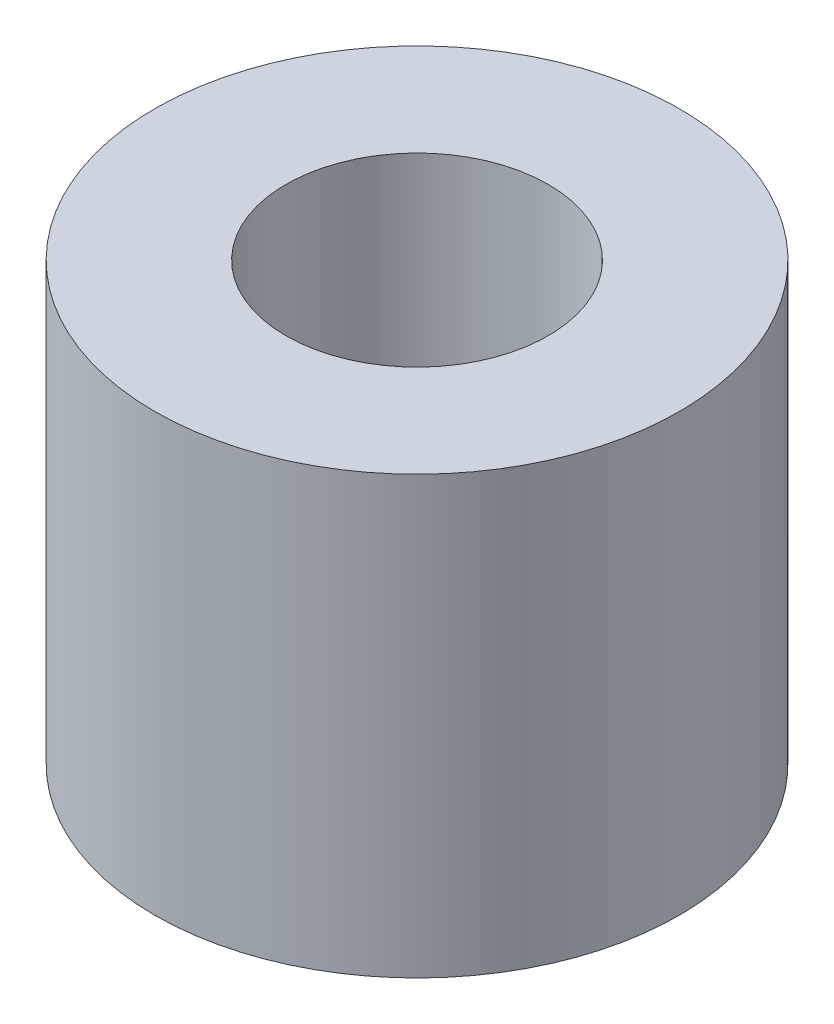
ISO-10303-21;
HEADER;
FILE_DESCRIPTION(('STEP AP214'),'2;1');
FILE_NAME('part.step','',(''),(''),'','','');
FILE_SCHEMA(('AUTOMOTIVE_DESIGN { 1 0 10303 214 1 1 1 1 }'));
ENDSEC;
DATA;
#1=APPLICATION_CONTEXT('core data for automotive mechanical design processes');
#2=APPLICATION_PROTOCOL_DEFINITION('international standard','automotive_design',2000,#1);
#3=PRODUCT_CONTEXT('',#1,'mechanical');
#4=PRODUCT('Part','Part','',(#3));
#5=PRODUCT_RELATED_PRODUCT_CATEGORY('part','',(#4));
#6=PRODUCT_DEFINITION_FORMATION('','',#4);
#7=PRODUCT_DEFINITION_CONTEXT('part definition',#1,'design');
#8=PRODUCT_DEFINITION('design','',#6,#7);
#9=PRODUCT_DEFINITION_SHAPE('','',#8);
#10=(LENGTH_UNIT() NAMED_UNIT(*) SI_UNIT(.MILLI.,.METRE.));
#11=(NAMED_UNIT(*) PLANE_ANGLE_UNIT() SI_UNIT($,.RADIAN.));
#12=(NAMED_UNIT(*) SI_UNIT($,.STERADIAN.) SOLID_ANGLE_UNIT());
#13=UNCERTAINTY_MEASURE_WITH_UNIT(LENGTH_MEASURE(1.E-05),#10,'distance_accuracy_value','');
#14=(GEOMETRIC_REPRESENTATION_CONTEXT(3) GLOBAL_UNCERTAINTY_ASSIGNED_CONTEXT((#13)) GLOBAL_UNIT_ASSIGNED_CONTEXT((#10,
#11,#12)) REPRESENTATION_CONTEXT('',''));
#15=CARTESIAN_POINT('',(0.,0.,0.));
#16=DIRECTION('',(0.,0.,1.));
#17=DIRECTION('',(1.,0.,0.));
#18=AXIS2_PLACEMENT_3D('',#15,#16,#17);
#19=CARTESIAN_POINT('',(0.,4.99,0.0185236370604577));
#20=DIRECTION('',(0.,1.,0.));
#21=DIRECTION('',(0.,0.,1.));
#22=AXIS2_PLACEMENT_3D('',#19,#20,#21);
#23=PLANE('',#22);
#24=CARTESIAN_POINT('',(0.,4.99,0.0185236370604577));
#25=DIRECTION('',(0.,1.,0.));
#26=DIRECTION('',(0.,0.,1.));
#27=AXIS2_PLACEMENT_3D('',#24,#25,#26);
#28=CIRCLE('',#27,3.);
#29=CARTESIAN_POINT('',(0.,4.99,3.01852363706046));
#30=VERTEX_POINT('',#29);
#31=EDGE_CURVE('E10',#30,#30,#28,.T.);
#32=ORIENTED_EDGE('',*,*,#31,.T.);
#33=EDGE_LOOP('',(#32));
#34=FACE_BOUND('',#33,.T.);
#35=CARTESIAN_POINT('',(0.,4.99,0.0185236370604577));
#36=DIRECTION('',(0.,1.,0.));
#37=DIRECTION('',(0.,0.,1.));
#38=AXIS2_PLACEMENT_3D('',#35,#36,#37);
#39=CIRCLE('',#38,1.5);
#40=CARTESIAN_POINT('',(0.,4.99,1.51852363706046));
#41=VERTEX_POINT('',#40);
#42=EDGE_CURVE('E54',#41,#41,#39,.T.);
#43=ORIENTED_EDGE('',*,*,#42,.F.);
#44=EDGE_LOOP('',(#43));
#45=FACE_BOUND('',#44,.T.);
#46=ADVANCED_FACE('F41',(#34,#45),#23,.T.);
#47=CARTESIAN_POINT('',(0.,0.,0.0185236370604577));
#48=DIRECTION('',(0.,1.,0.));
#49=DIRECTION('',(0.,0.,1.));
#50=AXIS2_PLACEMENT_3D('',#47,#48,#49);
#51=PLANE('',#50);
#52=CARTESIAN_POINT('',(0.,0.,0.0185236370604577));
#53=DIRECTION('',(0.,1.,0.));
#54=DIRECTION('',(0.,0.,1.));
#55=AXIS2_PLACEMENT_3D('',#52,#53,#54);
#56=CIRCLE('',#55,3.);
#57=CARTESIAN_POINT('',(0.,0.,3.01852363706046));
#58=VERTEX_POINT('',#57);
#59=EDGE_CURVE('E45',#58,#58,#56,.T.);
#60=ORIENTED_EDGE('',*,*,#59,.F.);
#61=EDGE_LOOP('',(#60));
#62=FACE_BOUND('',#61,.T.);
#63=CARTESIAN_POINT('',(0.,0.,0.0185236370604577));
#64=DIRECTION('',(0.,1.,0.));
#65=DIRECTION('',(0.,0.,1.));
#66=AXIS2_PLACEMENT_3D('',#63,#64,#65);
#67=CIRCLE('',#66,1.5);
#68=CARTESIAN_POINT('',(0.,0.,1.51852363706046));
#69=VERTEX_POINT('',#68);
#70=EDGE_CURVE('E56',#69,#69,#67,.T.);
#71=ORIENTED_EDGE('',*,*,#70,.T.);
#72=EDGE_LOOP('',(#71));
#73=FACE_BOUND('',#72,.T.);
#74=ADVANCED_FACE('F68',(#62,#73),#51,.F.);
#75=CARTESIAN_POINT('',(0.,4.99,0.0185236370604577));
#76=DIRECTION('',(0.,-1.,0.));
#77=DIRECTION('',(0.,0.,-1.));
#78=AXIS2_PLACEMENT_3D('',#75,#76,#77);
#79=CYLINDRICAL_SURFACE('',#78,3.);
#80=ORIENTED_EDGE('',*,*,#31,.F.);
#81=EDGE_LOOP('',(#80));
#82=FACE_BOUND('',#81,.T.);
#83=ORIENTED_EDGE('',*,*,#59,.T.);
#84=EDGE_LOOP('',(#83));
#85=FACE_BOUND('',#84,.T.);
#86=ADVANCED_FACE('F43',(#82,#85),#79,.T.);
#87=CARTESIAN_POINT('',(0.,4.99,0.0185236370604577));
#88=DIRECTION('',(0.,-1.,0.));
#89=DIRECTION('',(0.,0.,-1.));
#90=AXIS2_PLACEMENT_3D('',#87,#88,#89);
#91=CYLINDRICAL_SURFACE('',#90,1.5);
#92=ORIENTED_EDGE('',*,*,#42,.T.);
#93=EDGE_LOOP('',(#92));
#94=FACE_BOUND('',#93,.T.);
#95=ORIENTED_EDGE('',*,*,#70,.F.);
#96=EDGE_LOOP('',(#95));
#97=FACE_BOUND('',#96,.T.);
#98=ADVANCED_FACE('F64',(#94,#97),#91,.F.);
#99=CLOSED_SHELL('',(#46,#74,#86,#98));
#100=MANIFOLD_SOLID_BREP('B2',#99);
#101=ADVANCED_BREP_SHAPE_REPRESENTATION('',(#18,#100),#14);
#102=SHAPE_DEFINITION_REPRESENTATION(#9,#101);
ENDSEC;
END-ISO-10303-21;
